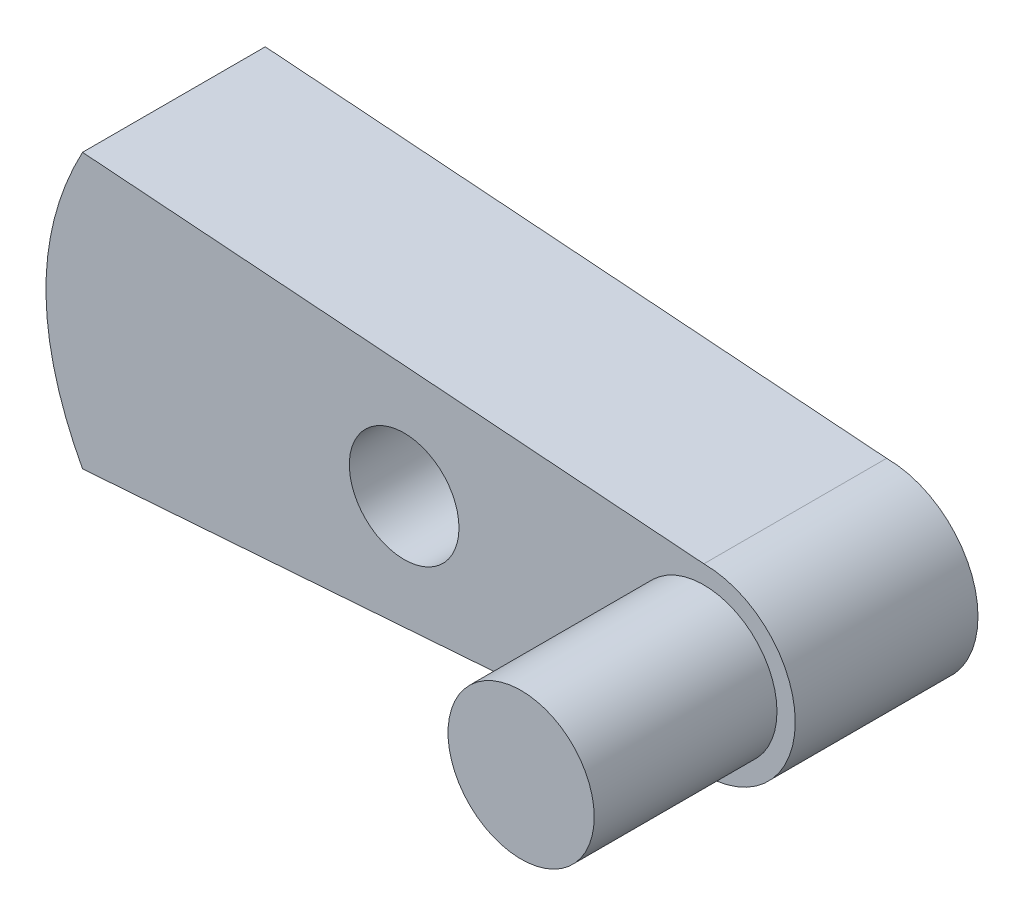
ISO-10303-21;
HEADER;
FILE_DESCRIPTION(('STEP AP214'),'2;1');
FILE_NAME('part.step','',(''),(''),'','','');
FILE_SCHEMA(('AUTOMOTIVE_DESIGN { 1 0 10303 214 1 1 1 1 }'));
ENDSEC;
DATA;
#1=APPLICATION_CONTEXT('core data for automotive mechanical design processes');
#2=APPLICATION_PROTOCOL_DEFINITION('international standard','automotive_design',2000,#1);
#3=PRODUCT_CONTEXT('',#1,'mechanical');
#4=PRODUCT('Part','Part','',(#3));
#5=PRODUCT_RELATED_PRODUCT_CATEGORY('part','',(#4));
#6=PRODUCT_DEFINITION_FORMATION('','',#4);
#7=PRODUCT_DEFINITION_CONTEXT('part definition',#1,'design');
#8=PRODUCT_DEFINITION('design','',#6,#7);
#9=PRODUCT_DEFINITION_SHAPE('','',#8);
#10=(LENGTH_UNIT() NAMED_UNIT(*) SI_UNIT(.MILLI.,.METRE.));
#11=(NAMED_UNIT(*) PLANE_ANGLE_UNIT() SI_UNIT($,.RADIAN.));
#12=(NAMED_UNIT(*) SI_UNIT($,.STERADIAN.) SOLID_ANGLE_UNIT());
#13=UNCERTAINTY_MEASURE_WITH_UNIT(LENGTH_MEASURE(1.E-05),#10,'distance_accuracy_value','');
#14=(GEOMETRIC_REPRESENTATION_CONTEXT(3) GLOBAL_UNCERTAINTY_ASSIGNED_CONTEXT((#13)) GLOBAL_UNIT_ASSIGNED_CONTEXT((#10,
#11,#12)) REPRESENTATION_CONTEXT('',''));
#15=CARTESIAN_POINT('',(0.,0.,0.));
#16=DIRECTION('',(0.,0.,1.));
#17=DIRECTION('',(1.,0.,0.));
#18=AXIS2_PLACEMENT_3D('',#15,#16,#17);
#19=CARTESIAN_POINT('',(-5.43656654719606,31.2021970096863,12.7));
#20=CARTESIAN_POINT('',(-10.5165665471961,21.6771970096863,12.7));
#21=CARTESIAN_POINT('',(-5.43656654719606,12.1521970096863,12.7));
#22=B_SPLINE_CURVE_WITH_KNOTS('',2,(#19,#20,#21),.UNSPECIFIED.,.F.,.F.,(3,3),(0.,1.),.UNSPECIFIED.);
#23=DIRECTION('',(0.,0.,-1.));
#24=VECTOR('',#23,1.);
#25=SURFACE_OF_LINEAR_EXTRUSION('',#22,#24);
#26=CARTESIAN_POINT('',(-5.43656654719606,31.2021970096863,0.));
#27=CARTESIAN_POINT('',(-10.5165665471961,21.6771970096863,0.));
#28=CARTESIAN_POINT('',(-5.43656654719606,12.1521970096863,0.));
#29=B_SPLINE_CURVE_WITH_KNOTS('',2,(#26,#27,#28),.UNSPECIFIED.,.F.,.F.,(3,3),(0.,1.),.UNSPECIFIED.);
#30=CARTESIAN_POINT('',(-5.43656654719606,31.2021970096863,0.));
#31=VERTEX_POINT('',#30);
#32=CARTESIAN_POINT('',(-5.43656654719606,12.1521970096863,0.));
#33=VERTEX_POINT('',#32);
#34=EDGE_CURVE('E109',#31,#33,#29,.T.);
#35=ORIENTED_EDGE('',*,*,#34,.T.);
#36=DIRECTION('',(0.,0.,-1.));
#37=VECTOR('',#36,1.);
#38=CARTESIAN_POINT('',(-5.43656654719606,12.1521970096863,12.7));
#39=LINE('',#38,#37);
#40=CARTESIAN_POINT('',(-5.43656654719606,12.1521970096863,12.7));
#41=VERTEX_POINT('',#40);
#42=EDGE_CURVE('E11',#41,#33,#39,.T.);
#43=ORIENTED_EDGE('',*,*,#42,.F.);
#44=CARTESIAN_POINT('',(-5.43656654719606,31.2021970096863,12.7));
#45=VERTEX_POINT('',#44);
#46=EDGE_CURVE('E93',#45,#41,#22,.T.);
#47=ORIENTED_EDGE('',*,*,#46,.F.);
#48=DIRECTION('',(0.,0.,-1.));
#49=VECTOR('',#48,1.);
#50=CARTESIAN_POINT('',(-5.43656654719606,31.2021970096863,12.7));
#51=LINE('',#50,#49);
#52=EDGE_CURVE('E106',#45,#31,#51,.T.);
#53=ORIENTED_EDGE('',*,*,#52,.T.);
#54=EDGE_LOOP('',(#35,#43,#47,#53));
#55=FACE_BOUND('',#54,.T.);
#56=ADVANCED_FACE('F39',(#55),#25,.F.);
#57=CARTESIAN_POINT('',(37.7434334528039,15.3271970096863,12.7));
#58=DIRECTION('',(-0.0733314430360542,0.997307625290336,0.));
#59=DIRECTION('',(-0.997307625290336,-0.0733314430360542,0.));
#60=AXIS2_PLACEMENT_3D('',#57,#58,#59);
#61=PLANE('',#60);
#62=DIRECTION('',(0.997307625290336,0.0733314430360541,0.));
#63=VECTOR('',#62,1.);
#64=CARTESIAN_POINT('',(37.7434334528039,15.3271970096863,0.));
#65=LINE('',#64,#63);
#66=CARTESIAN_POINT('',(37.7434334528039,15.3271970096863,0.));
#67=VERTEX_POINT('',#66);
#68=EDGE_CURVE('E98',#33,#67,#65,.T.);
#69=ORIENTED_EDGE('',*,*,#68,.T.);
#70=DIRECTION('',(0.,0.,-1.));
#71=VECTOR('',#70,1.);
#72=CARTESIAN_POINT('',(37.7434334528039,15.3271970096863,12.7));
#73=LINE('',#72,#71);
#74=CARTESIAN_POINT('',(37.7434334528039,15.3271970096863,12.7));
#75=VERTEX_POINT('',#74);
#76=EDGE_CURVE('E50',#75,#67,#73,.T.);
#77=ORIENTED_EDGE('',*,*,#76,.F.);
#78=DIRECTION('',(0.997307625290336,0.0733314430360541,0.));
#79=VECTOR('',#78,1.);
#80=CARTESIAN_POINT('',(37.7434334528039,15.3271970096863,12.7));
#81=LINE('',#80,#79);
#82=EDGE_CURVE('E88',#41,#75,#81,.T.);
#83=ORIENTED_EDGE('',*,*,#82,.F.);
#84=ORIENTED_EDGE('',*,*,#42,.T.);
#85=EDGE_LOOP('',(#69,#77,#83,#84));
#86=FACE_BOUND('',#85,.T.);
#87=ADVANCED_FACE('F97',(#86),#61,.F.);
#88=CARTESIAN_POINT('',(37.7434334528039,21.6771970096863,12.7));
#89=DIRECTION('',(0.,0.,-1.));
#90=DIRECTION('',(-1.,0.,0.));
#91=AXIS2_PLACEMENT_3D('',#88,#89,#90);
#92=CYLINDRICAL_SURFACE('',#91,6.35);
#93=CARTESIAN_POINT('',(37.7434334528039,21.6771970096863,0.));
#94=DIRECTION('',(0.,0.,1.));
#95=DIRECTION('',(-1.,0.,0.));
#96=AXIS2_PLACEMENT_3D('',#93,#94,#95);
#97=CIRCLE('',#96,6.35);
#98=CARTESIAN_POINT('',(37.7434334528039,28.0271970096863,0.));
#99=VERTEX_POINT('',#98);
#100=EDGE_CURVE('E75',#67,#99,#97,.T.);
#101=ORIENTED_EDGE('',*,*,#100,.T.);
#102=DIRECTION('',(0.,0.,-1.));
#103=VECTOR('',#102,1.);
#104=CARTESIAN_POINT('',(37.7434334528039,28.0271970096863,12.7));
#105=LINE('',#104,#103);
#106=CARTESIAN_POINT('',(37.7434334528039,28.0271970096863,12.7));
#107=VERTEX_POINT('',#106);
#108=EDGE_CURVE('E100',#107,#99,#105,.T.);
#109=ORIENTED_EDGE('',*,*,#108,.F.);
#110=CARTESIAN_POINT('',(37.7434334528039,21.6771970096863,12.7));
#111=DIRECTION('',(0.,0.,1.));
#112=DIRECTION('',(-1.,0.,0.));
#113=AXIS2_PLACEMENT_3D('',#110,#111,#112);
#114=CIRCLE('',#113,6.35);
#115=EDGE_CURVE('E91',#75,#107,#114,.T.);
#116=ORIENTED_EDGE('',*,*,#115,.F.);
#117=ORIENTED_EDGE('',*,*,#76,.T.);
#118=EDGE_LOOP('',(#101,#109,#116,#117));
#119=FACE_BOUND('',#118,.T.);
#120=ADVANCED_FACE('F102',(#119),#92,.T.);
#121=CARTESIAN_POINT('',(-5.43656654719606,31.2021970096863,12.7));
#122=DIRECTION('',(-0.0733314430360542,-0.997307625290336,0.));
#123=DIRECTION('',(0.997307625290336,-0.0733314430360542,0.));
#124=AXIS2_PLACEMENT_3D('',#121,#122,#123);
#125=PLANE('',#124);
#126=DIRECTION('',(-0.997307625290336,0.0733314430360542,0.));
#127=VECTOR('',#126,1.);
#128=CARTESIAN_POINT('',(-5.43656654719606,31.2021970096863,0.));
#129=LINE('',#128,#127);
#130=EDGE_CURVE('E81',#99,#31,#129,.T.);
#131=ORIENTED_EDGE('',*,*,#130,.T.);
#132=ORIENTED_EDGE('',*,*,#52,.F.);
#133=DIRECTION('',(-0.997307625290336,0.0733314430360542,0.));
#134=VECTOR('',#133,1.);
#135=CARTESIAN_POINT('',(-5.43656654719606,31.2021970096863,12.7));
#136=LINE('',#135,#134);
#137=EDGE_CURVE('E58',#107,#45,#136,.T.);
#138=ORIENTED_EDGE('',*,*,#137,.F.);
#139=ORIENTED_EDGE('',*,*,#108,.T.);
#140=EDGE_LOOP('',(#131,#132,#138,#139));
#141=FACE_BOUND('',#140,.T.);
#142=ADVANCED_FACE('F128',(#141),#125,.F.);
#143=CARTESIAN_POINT('',(-7.97656654719606,21.6771970096863,12.7));
#144=DIRECTION('',(0.,0.,1.));
#145=DIRECTION('',(1.,0.,0.));
#146=AXIS2_PLACEMENT_3D('',#143,#144,#145);
#147=PLANE('',#146);
#148=CARTESIAN_POINT('',(16.9154334528039,21.6771970096863,12.7));
#149=DIRECTION('',(0.,0.,1.));
#150=DIRECTION('',(1.,0.,0.));
#151=AXIS2_PLACEMENT_3D('',#148,#149,#150);
#152=CIRCLE('',#151,3.81);
#153=CARTESIAN_POINT('',(20.7254334528039,21.6771970096863,12.7));
#154=VERTEX_POINT('',#153);
#155=EDGE_CURVE('E148',#154,#154,#152,.F.);
#156=ORIENTED_EDGE('',*,*,#155,.T.);
#157=EDGE_LOOP('',(#156));
#158=FACE_BOUND('',#157,.T.);
#159=CARTESIAN_POINT('',(37.7434334528039,21.6771970096863,12.7));
#160=DIRECTION('',(0.,0.,1.));
#161=DIRECTION('',(1.,0.,0.));
#162=AXIS2_PLACEMENT_3D('',#159,#160,#161);
#163=CIRCLE('',#162,5.08);
#164=CARTESIAN_POINT('',(42.8234334528039,21.6771970096863,12.7));
#165=VERTEX_POINT('',#164);
#166=EDGE_CURVE('E115',#165,#165,#163,.F.);
#167=ORIENTED_EDGE('',*,*,#166,.T.);
#168=EDGE_LOOP('',(#167));
#169=FACE_BOUND('',#168,.T.);
#170=ORIENTED_EDGE('',*,*,#46,.T.);
#171=ORIENTED_EDGE('',*,*,#82,.T.);
#172=ORIENTED_EDGE('',*,*,#115,.T.);
#173=ORIENTED_EDGE('',*,*,#137,.T.);
#174=EDGE_LOOP('',(#170,#171,#172,#173));
#175=FACE_BOUND('',#174,.T.);
#176=ADVANCED_FACE('F89',(#158,#169,#175),#147,.T.);
#177=CARTESIAN_POINT('',(-7.97656654719606,21.6771970096863,0.));
#178=DIRECTION('',(0.,0.,1.));
#179=DIRECTION('',(1.,0.,0.));
#180=AXIS2_PLACEMENT_3D('',#177,#178,#179);
#181=PLANE('',#180);
#182=CARTESIAN_POINT('',(16.9154334528039,21.6771970096863,0.));
#183=DIRECTION('',(0.,0.,1.));
#184=DIRECTION('',(1.,0.,0.));
#185=AXIS2_PLACEMENT_3D('',#182,#183,#184);
#186=CIRCLE('',#185,3.81);
#187=CARTESIAN_POINT('',(20.7254334528039,21.6771970096863,0.));
#188=VERTEX_POINT('',#187);
#189=EDGE_CURVE('E43',#188,#188,#186,.F.);
#190=ORIENTED_EDGE('',*,*,#189,.F.);
#191=EDGE_LOOP('',(#190));
#192=FACE_BOUND('',#191,.T.);
#193=ORIENTED_EDGE('',*,*,#34,.F.);
#194=ORIENTED_EDGE('',*,*,#130,.F.);
#195=ORIENTED_EDGE('',*,*,#100,.F.);
#196=ORIENTED_EDGE('',*,*,#68,.F.);
#197=EDGE_LOOP('',(#193,#194,#195,#196));
#198=FACE_BOUND('',#197,.T.);
#199=ADVANCED_FACE('F131',(#192,#198),#181,.F.);
#200=CARTESIAN_POINT('',(37.7434334528039,21.6771970096863,25.4));
#201=DIRECTION('',(0.,0.,-1.));
#202=DIRECTION('',(-1.,0.,0.));
#203=AXIS2_PLACEMENT_3D('',#200,#201,#202);
#204=CYLINDRICAL_SURFACE('',#203,5.08);
#205=ORIENTED_EDGE('',*,*,#166,.F.);
#206=EDGE_LOOP('',(#205));
#207=FACE_BOUND('',#206,.T.);
#208=CARTESIAN_POINT('',(37.7434334528039,21.6771970096863,25.4));
#209=DIRECTION('',(0.,0.,1.));
#210=DIRECTION('',(1.,0.,0.));
#211=AXIS2_PLACEMENT_3D('',#208,#209,#210);
#212=CIRCLE('',#211,5.08);
#213=CARTESIAN_POINT('',(42.8234334528039,21.6771970096863,25.4));
#214=VERTEX_POINT('',#213);
#215=EDGE_CURVE('E144',#214,#214,#212,.T.);
#216=ORIENTED_EDGE('',*,*,#215,.F.);
#217=EDGE_LOOP('',(#216));
#218=FACE_BOUND('',#217,.T.);
#219=ADVANCED_FACE('F160',(#207,#218),#204,.T.);
#220=CARTESIAN_POINT('',(37.7434334528039,21.6771970096863,25.4));
#221=DIRECTION('',(0.,0.,1.));
#222=DIRECTION('',(1.,0.,0.));
#223=AXIS2_PLACEMENT_3D('',#220,#221,#222);
#224=PLANE('',#223);
#225=ORIENTED_EDGE('',*,*,#215,.T.);
#226=EDGE_LOOP('',(#225));
#227=FACE_BOUND('',#226,.T.);
#228=ADVANCED_FACE('F166',(#227),#224,.T.);
#229=CARTESIAN_POINT('',(16.9154334528039,21.6771970096863,19.558));
#230=DIRECTION('',(0.,0.,-1.));
#231=DIRECTION('',(-1.,0.,0.));
#232=AXIS2_PLACEMENT_3D('',#229,#230,#231);
#233=CYLINDRICAL_SURFACE('',#232,3.81);
#234=ORIENTED_EDGE('',*,*,#155,.F.);
#235=EDGE_LOOP('',(#234));
#236=FACE_BOUND('',#235,.T.);
#237=ORIENTED_EDGE('',*,*,#189,.T.);
#238=EDGE_LOOP('',(#237));
#239=FACE_BOUND('',#238,.T.);
#240=ADVANCED_FACE('F157',(#236,#239),#233,.F.);
#241=CLOSED_SHELL('',(#56,#87,#120,#142,#176,#199,#219,#228,#240));
#242=MANIFOLD_SOLID_BREP('B2',#241);
#243=ADVANCED_BREP_SHAPE_REPRESENTATION('',(#18,#242),#14);
#244=SHAPE_DEFINITION_REPRESENTATION(#9,#243);
ENDSEC;
END-ISO-10303-21;
